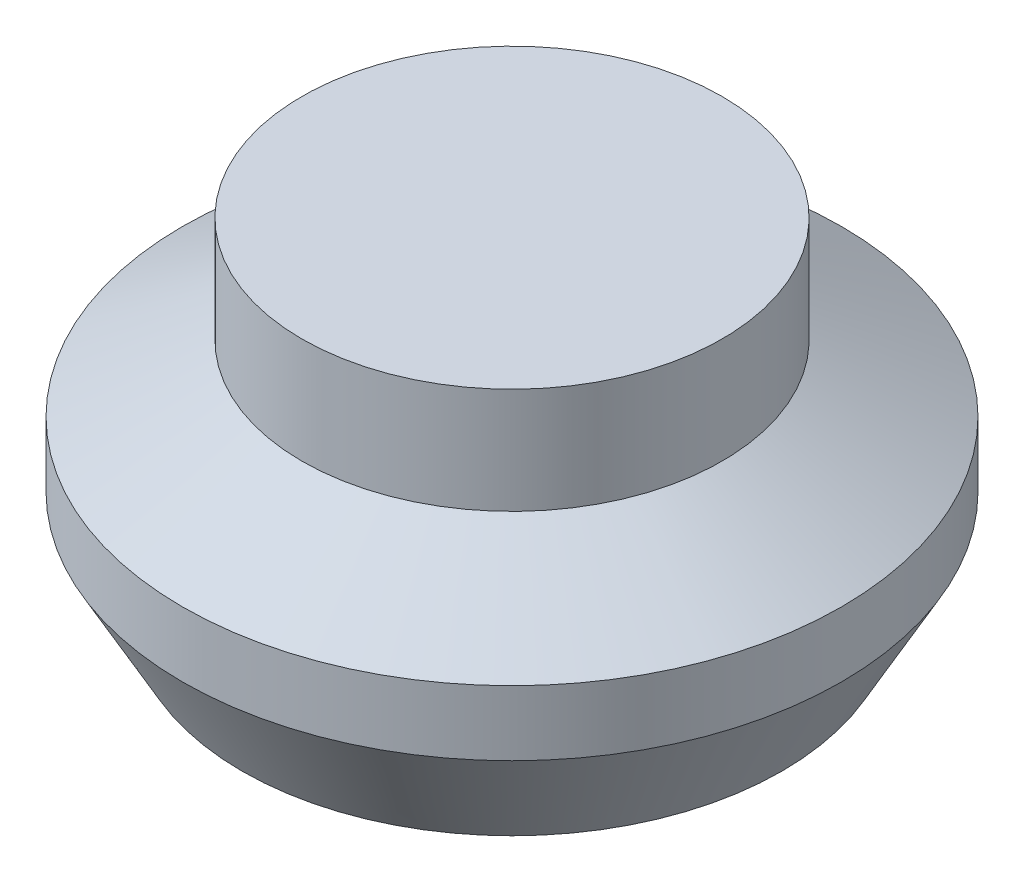
ISO-10303-21;
HEADER;
FILE_DESCRIPTION(('STEP AP214'),'2;1');
FILE_NAME('part.step','',(''),(''),'','','');
FILE_SCHEMA(('AUTOMOTIVE_DESIGN { 1 0 10303 214 1 1 1 1 }'));
ENDSEC;
DATA;
#1=APPLICATION_CONTEXT('core data for automotive mechanical design processes');
#2=APPLICATION_PROTOCOL_DEFINITION('international standard','automotive_design',2000,#1);
#3=PRODUCT_CONTEXT('',#1,'mechanical');
#4=PRODUCT('Part','Part','',(#3));
#5=PRODUCT_RELATED_PRODUCT_CATEGORY('part','',(#4));
#6=PRODUCT_DEFINITION_FORMATION('','',#4);
#7=PRODUCT_DEFINITION_CONTEXT('part definition',#1,'design');
#8=PRODUCT_DEFINITION('design','',#6,#7);
#9=PRODUCT_DEFINITION_SHAPE('','',#8);
#10=(LENGTH_UNIT() NAMED_UNIT(*) SI_UNIT(.MILLI.,.METRE.));
#11=(NAMED_UNIT(*) PLANE_ANGLE_UNIT() SI_UNIT($,.RADIAN.));
#12=(NAMED_UNIT(*) SI_UNIT($,.STERADIAN.) SOLID_ANGLE_UNIT());
#13=UNCERTAINTY_MEASURE_WITH_UNIT(LENGTH_MEASURE(1.E-05),#10,'distance_accuracy_value','');
#14=(GEOMETRIC_REPRESENTATION_CONTEXT(3) GLOBAL_UNCERTAINTY_ASSIGNED_CONTEXT((#13)) GLOBAL_UNIT_ASSIGNED_CONTEXT((#10,
#11,#12)) REPRESENTATION_CONTEXT('',''));
#15=CARTESIAN_POINT('',(0.,0.,0.));
#16=DIRECTION('',(0.,0.,1.));
#17=DIRECTION('',(1.,0.,0.));
#18=AXIS2_PLACEMENT_3D('',#15,#16,#17);
#19=CARTESIAN_POINT('',(0.,36.8350544089064,0.));
#20=DIRECTION('',(0.,1.,0.));
#21=DIRECTION('',(0.,0.,1.));
#22=AXIS2_PLACEMENT_3D('',#19,#20,#21);
#23=PLANE('',#22);
#24=CARTESIAN_POINT('',(0.,36.8350544089064,0.));
#25=DIRECTION('',(0.,-1.,0.));
#26=DIRECTION('',(0.,0.,-1.));
#27=AXIS2_PLACEMENT_3D('',#24,#25,#26);
#28=CIRCLE('',#27,22.407319749838);
#29=CARTESIAN_POINT('',(0.,36.8350544089064,-22.407319749838));
#30=VERTEX_POINT('',#29);
#31=EDGE_CURVE('E11',#30,#30,#28,.T.);
#32=ORIENTED_EDGE('',*,*,#31,.F.);
#33=EDGE_LOOP('',(#32));
#34=FACE_BOUND('',#33,.T.);
#35=ADVANCED_FACE('F37',(#34),#23,.T.);
#36=CARTESIAN_POINT('',(0.,0.,0.));
#37=DIRECTION('',(0.,-1.,0.));
#38=DIRECTION('',(0.,0.,-1.));
#39=AXIS2_PLACEMENT_3D('',#36,#37,#38);
#40=CYLINDRICAL_SURFACE('',#39,22.407319749838);
#41=ORIENTED_EDGE('',*,*,#31,.T.);
#42=EDGE_LOOP('',(#41));
#43=FACE_BOUND('',#42,.T.);
#44=CARTESIAN_POINT('',(0.,25.5507926643837,0.));
#45=DIRECTION('',(0.,-1.,0.));
#46=DIRECTION('',(0.,0.,-1.));
#47=AXIS2_PLACEMENT_3D('',#44,#45,#46);
#48=CIRCLE('',#47,22.407319749838);
#49=CARTESIAN_POINT('',(0.,25.5507926643837,-22.407319749838));
#50=VERTEX_POINT('',#49);
#51=EDGE_CURVE('E43',#50,#50,#48,.T.);
#52=ORIENTED_EDGE('',*,*,#51,.F.);
#53=EDGE_LOOP('',(#52));
#54=FACE_BOUND('',#53,.T.);
#55=ADVANCED_FACE('F59',(#43,#54),#40,.T.);
#56=CARTESIAN_POINT('',(0.,18.4578281392551,0.));
#57=DIRECTION('',(0.,-1.,0.));
#58=DIRECTION('',(0.,0.,-1.));
#59=AXIS2_PLACEMENT_3D('',#56,#57,#58);
#60=CONICAL_SURFACE('',#59,35.142415147228,1.06262370895957);
#61=ORIENTED_EDGE('',*,*,#51,.T.);
#62=EDGE_LOOP('',(#61));
#63=FACE_BOUND('',#62,.T.);
#64=CARTESIAN_POINT('',(0.,18.4578281392551,0.));
#65=DIRECTION('',(0.,-1.,0.));
#66=DIRECTION('',(0.,0.,-1.));
#67=AXIS2_PLACEMENT_3D('',#64,#65,#66);
#68=CIRCLE('',#67,35.142415147228);
#69=CARTESIAN_POINT('',(0.,18.4578281392551,-35.142415147228));
#70=VERTEX_POINT('',#69);
#71=EDGE_CURVE('E71',#70,#70,#68,.T.);
#72=ORIENTED_EDGE('',*,*,#71,.F.);
#73=EDGE_LOOP('',(#72));
#74=FACE_BOUND('',#73,.T.);
#75=ADVANCED_FACE('F64',(#63,#74),#60,.T.);
#76=CARTESIAN_POINT('',(0.,0.,0.));
#77=DIRECTION('',(0.,-1.,0.));
#78=DIRECTION('',(0.,0.,-1.));
#79=AXIS2_PLACEMENT_3D('',#76,#77,#78);
#80=CYLINDRICAL_SURFACE('',#79,35.142415147228);
#81=ORIENTED_EDGE('',*,*,#71,.T.);
#82=EDGE_LOOP('',(#81));
#83=FACE_BOUND('',#82,.T.);
#84=CARTESIAN_POINT('',(0.,11.526067353334,0.));
#85=DIRECTION('',(0.,-1.,0.));
#86=DIRECTION('',(0.,0.,-1.));
#87=AXIS2_PLACEMENT_3D('',#84,#85,#86);
#88=CIRCLE('',#87,35.142415147228);
#89=CARTESIAN_POINT('',(0.,11.526067353334,-35.142415147228));
#90=VERTEX_POINT('',#89);
#91=EDGE_CURVE('E73',#90,#90,#88,.T.);
#92=ORIENTED_EDGE('',*,*,#91,.F.);
#93=EDGE_LOOP('',(#92));
#94=FACE_BOUND('',#93,.T.);
#95=ADVANCED_FACE('F87',(#83,#94),#80,.T.);
#96=CARTESIAN_POINT('',(0.,0.09342489431339,0.));
#97=DIRECTION('',(0.,1.,0.));
#98=DIRECTION('',(0.,0.,1.));
#99=AXIS2_PLACEMENT_3D('',#96,#97,#98);
#100=CONICAL_SURFACE('',#99,28.774867448533,0.50817261783533);
#101=ORIENTED_EDGE('',*,*,#91,.T.);
#102=EDGE_LOOP('',(#101));
#103=FACE_BOUND('',#102,.T.);
#104=CARTESIAN_POINT('',(0.,0.09342489431339,0.));
#105=DIRECTION('',(0.,-1.,0.));
#106=DIRECTION('',(0.,0.,-1.));
#107=AXIS2_PLACEMENT_3D('',#104,#105,#106);
#108=CIRCLE('',#107,28.774867448533);
#109=CARTESIAN_POINT('',(0.,0.09342489431339,-28.774867448533));
#110=VERTEX_POINT('',#109);
#111=EDGE_CURVE('E78',#110,#110,#108,.T.);
#112=ORIENTED_EDGE('',*,*,#111,.F.);
#113=EDGE_LOOP('',(#112));
#114=FACE_BOUND('',#113,.T.);
#115=ADVANCED_FACE('F54',(#103,#114),#100,.T.);
#116=CARTESIAN_POINT('',(28.774867448533,0.09342489431339,0.));
#117=DIRECTION('',(0.,-1.,0.));
#118=DIRECTION('',(0.,0.,-1.));
#119=AXIS2_PLACEMENT_3D('',#116,#117,#118);
#120=PLANE('',#119);
#121=ORIENTED_EDGE('',*,*,#111,.T.);
#122=EDGE_LOOP('',(#121));
#123=FACE_BOUND('',#122,.T.);
#124=CARTESIAN_POINT('',(0.,0.09342489431339,0.));
#125=DIRECTION('',(0.,-1.,0.));
#126=DIRECTION('',(0.,0.,-1.));
#127=AXIS2_PLACEMENT_3D('',#124,#125,#126);
#128=CIRCLE('',#127,14.0247253110497);
#129=CARTESIAN_POINT('',(0.,0.09342489431339,-14.0247253110497));
#130=VERTEX_POINT('',#129);
#131=EDGE_CURVE('E81',#130,#130,#128,.T.);
#132=ORIENTED_EDGE('',*,*,#131,.F.);
#133=EDGE_LOOP('',(#132));
#134=FACE_BOUND('',#133,.T.);
#135=ADVANCED_FACE('F48',(#123,#134),#120,.T.);
#136=CARTESIAN_POINT('',(0.,-17.6518094432177,0.));
#137=DIRECTION('',(0.,1.,0.));
#138=DIRECTION('',(0.,0.,1.));
#139=AXIS2_PLACEMENT_3D('',#136,#137,#138);
#140=CONICAL_SURFACE('',#139,0.,0.668821381723666);
#141=ORIENTED_EDGE('',*,*,#131,.T.);
#142=EDGE_LOOP('',(#141));
#143=FACE_BOUND('',#142,.T.);
#144=CARTESIAN_POINT('',(0.,-17.6518094432177,0.));
#145=VERTEX_POINT('',#144);
#146=VERTEX_LOOP('',#145);
#147=FACE_BOUND('',#146,.T.);
#148=ADVANCED_FACE('F46',(#143,#147),#140,.T.);
#149=CLOSED_SHELL('',(#35,#55,#75,#95,#115,#135,#148));
#150=MANIFOLD_SOLID_BREP('B2',#149);
#151=ADVANCED_BREP_SHAPE_REPRESENTATION('',(#18,#150),#14);
#152=SHAPE_DEFINITION_REPRESENTATION(#9,#151);
ENDSEC;
END-ISO-10303-21;
